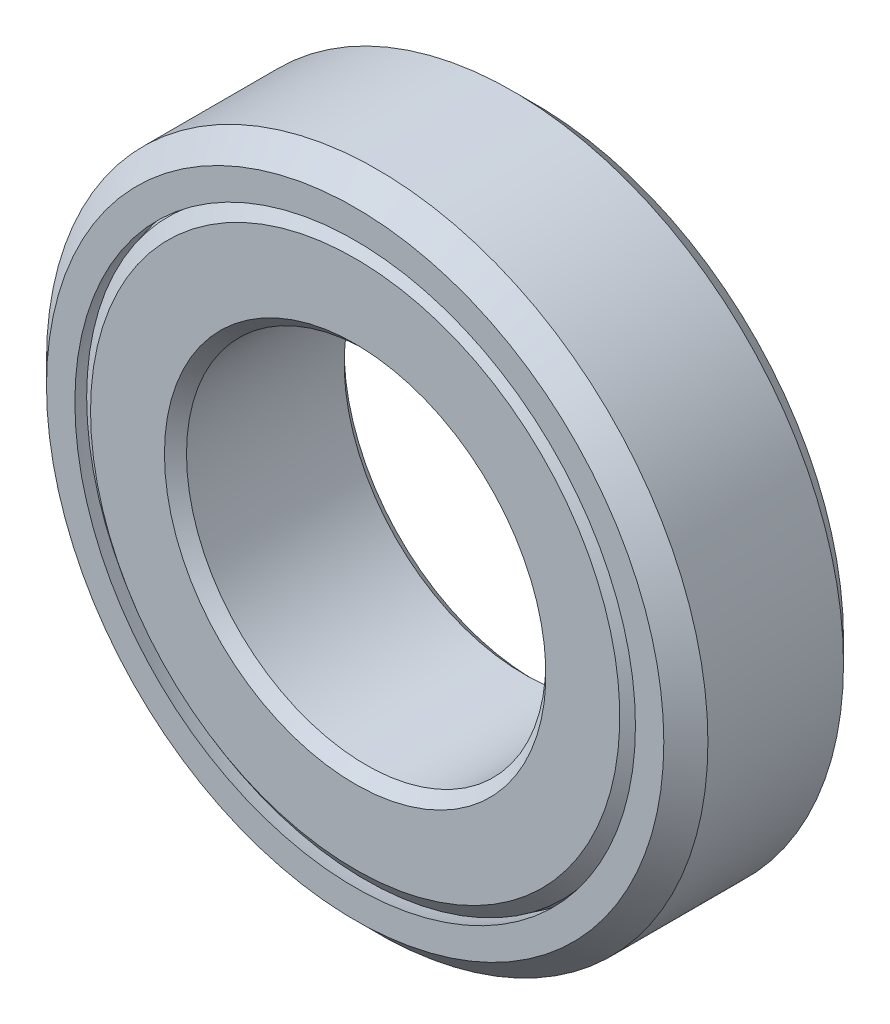
ISO-10303-21;
HEADER;
FILE_DESCRIPTION(('STEP AP214'),'2;1');
FILE_NAME('part.step','',(''),(''),'','','');
FILE_SCHEMA(('AUTOMOTIVE_DESIGN { 1 0 10303 214 1 1 1 1 }'));
ENDSEC;
DATA;
#1=APPLICATION_CONTEXT('core data for automotive mechanical design processes');
#2=APPLICATION_PROTOCOL_DEFINITION('international standard','automotive_design',2000,#1);
#3=PRODUCT_CONTEXT('',#1,'mechanical');
#4=PRODUCT('Part','Part','',(#3));
#5=PRODUCT_RELATED_PRODUCT_CATEGORY('part','',(#4));
#6=PRODUCT_DEFINITION_FORMATION('','',#4);
#7=PRODUCT_DEFINITION_CONTEXT('part definition',#1,'design');
#8=PRODUCT_DEFINITION('design','',#6,#7);
#9=PRODUCT_DEFINITION_SHAPE('','',#8);
#10=(LENGTH_UNIT() NAMED_UNIT(*) SI_UNIT(.MILLI.,.METRE.));
#11=(NAMED_UNIT(*) PLANE_ANGLE_UNIT() SI_UNIT($,.RADIAN.));
#12=(NAMED_UNIT(*) SI_UNIT($,.STERADIAN.) SOLID_ANGLE_UNIT());
#13=UNCERTAINTY_MEASURE_WITH_UNIT(LENGTH_MEASURE(1.E-05),#10,'distance_accuracy_value','');
#14=(GEOMETRIC_REPRESENTATION_CONTEXT(3) GLOBAL_UNCERTAINTY_ASSIGNED_CONTEXT((#13)) GLOBAL_UNIT_ASSIGNED_CONTEXT((#10,
#11,#12)) REPRESENTATION_CONTEXT('',''));
#15=CARTESIAN_POINT('',(0.,0.,0.));
#16=DIRECTION('',(0.,0.,1.));
#17=DIRECTION('',(1.,0.,0.));
#18=AXIS2_PLACEMENT_3D('',#15,#16,#17);
#19=CARTESIAN_POINT('',(0.,0.,-4.075));
#20=DIRECTION('',(0.,0.,1.));
#21=DIRECTION('',(1.,0.,0.));
#22=AXIS2_PLACEMENT_3D('',#19,#20,#21);
#23=PLANE('',#22);
#24=CARTESIAN_POINT('',(0.,0.,-4.075));
#25=DIRECTION('',(0.,0.,1.));
#26=DIRECTION('',(1.,0.,0.));
#27=AXIS2_PLACEMENT_3D('',#24,#25,#26);
#28=CIRCLE('',#27,14.);
#29=CARTESIAN_POINT('',(14.,0.,-4.075));
#30=VERTEX_POINT('',#29);
#31=EDGE_CURVE('E54',#30,#30,#28,.F.);
#32=ORIENTED_EDGE('',*,*,#31,.T.);
#33=EDGE_LOOP('',(#32));
#34=FACE_BOUND('',#33,.T.);
#35=CARTESIAN_POINT('',(0.,0.,-4.075));
#36=DIRECTION('',(0.,0.,1.));
#37=DIRECTION('',(1.,0.,0.));
#38=AXIS2_PLACEMENT_3D('',#35,#36,#37);
#39=CIRCLE('',#38,12.7128625808667);
#40=CARTESIAN_POINT('',(-12.7128625808667,0.,-4.075));
#41=VERTEX_POINT('',#40);
#42=EDGE_CURVE('E67',#41,#41,#39,.T.);
#43=ORIENTED_EDGE('',*,*,#42,.T.);
#44=EDGE_LOOP('',(#43));
#45=FACE_BOUND('',#44,.T.);
#46=ADVANCED_FACE('F46',(#34,#45),#23,.F.);
#47=CARTESIAN_POINT('',(0.,0.,4.075));
#48=DIRECTION('',(0.,0.,-1.));
#49=DIRECTION('',(-1.,0.,0.));
#50=AXIS2_PLACEMENT_3D('',#47,#48,#49);
#51=PLANE('',#50);
#52=CARTESIAN_POINT('',(0.,0.,4.075));
#53=DIRECTION('',(0.,0.,-1.));
#54=DIRECTION('',(-1.,0.,0.));
#55=AXIS2_PLACEMENT_3D('',#52,#53,#54);
#56=CIRCLE('',#55,14.);
#57=CARTESIAN_POINT('',(-14.,0.,4.075));
#58=VERTEX_POINT('',#57);
#59=EDGE_CURVE('E11',#58,#58,#56,.F.);
#60=ORIENTED_EDGE('',*,*,#59,.T.);
#61=EDGE_LOOP('',(#60));
#62=FACE_BOUND('',#61,.T.);
#63=CARTESIAN_POINT('',(0.,0.,4.075));
#64=DIRECTION('',(0.,0.,1.));
#65=DIRECTION('',(1.,0.,0.));
#66=AXIS2_PLACEMENT_3D('',#63,#64,#65);
#67=CIRCLE('',#66,12.7128625808667);
#68=CARTESIAN_POINT('',(-12.7128625808667,0.,4.075));
#69=VERTEX_POINT('',#68);
#70=EDGE_CURVE('E70',#69,#69,#67,.T.);
#71=ORIENTED_EDGE('',*,*,#70,.F.);
#72=EDGE_LOOP('',(#71));
#73=FACE_BOUND('',#72,.T.);
#74=ADVANCED_FACE('F77',(#62,#73),#51,.F.);
#75=CARTESIAN_POINT('',(0.,0.,0.));
#76=DIRECTION('',(0.,0.,1.));
#77=DIRECTION('',(-1.,0.,0.));
#78=AXIS2_PLACEMENT_3D('',#75,#76,#77);
#79=SPHERICAL_SURFACE('',#78,13.35);
#80=CARTESIAN_POINT('',(-12.7128625808667,0.,4.075));
#81=CARTESIAN_POINT('',(-12.7391968726643,0.,3.99284472978797));
#82=CARTESIAN_POINT('',(-12.764734574483,0.,3.91043412341195));
#83=CARTESIAN_POINT('',(-12.8142076748018,0.,3.74513335442746));
#84=CARTESIAN_POINT('',(-12.8381430733019,0.,3.66224319181899));
#85=CARTESIAN_POINT('',(-12.8844024436231,0.,3.49601442646513));
#86=CARTESIAN_POINT('',(-12.9067264154441,0.,3.41267582371974));
#87=CARTESIAN_POINT('',(-12.949754576065,0.,3.24558151102869));
#88=CARTESIAN_POINT('',(-12.9704587648649,0.,3.16182580108304));
#89=CARTESIAN_POINT('',(-13.0102395686577,0.,2.99392875075675));
#90=CARTESIAN_POINT('',(-13.0293161836506,0.,2.90978741037612));
#91=CARTESIAN_POINT('',(-13.065834672351,0.,2.74115072435144));
#92=CARTESIAN_POINT('',(-13.0832765460585,0.,2.65665537870738));
#93=CARTESIAN_POINT('',(-13.1165189960213,0.,2.48734243945082));
#94=CARTESIAN_POINT('',(-13.1323195722765,0.,2.40252484583832));
#95=CARTESIAN_POINT('',(-13.1622734888798,0.,2.23259928930536));
#96=CARTESIAN_POINT('',(-13.1764268292277,0.,2.14749132638491));
#97=CARTESIAN_POINT('',(-13.2030809544505,0.,1.97701701896486));
#98=CARTESIAN_POINT('',(-13.2155817393252,0.,1.89165067446527));
#99=CARTESIAN_POINT('',(-13.2389260552066,0.,1.7206916887461));
#100=CARTESIAN_POINT('',(-13.2497695862133,0.,1.63509904752652));
#101=CARTESIAN_POINT('',(-13.2697953188248,0.,1.46371963827511));
#102=CARTESIAN_POINT('',(-13.2789775204296,0.,1.37793287024329));
#103=CARTESIAN_POINT('',(-13.2956771431171,0.,1.20619745023881));
#104=CARTESIAN_POINT('',(-13.3031945641997,0.,1.12024879826615));
#105=CARTESIAN_POINT('',(-13.3165618004274,0.,0.948221914094963));
#106=CARTESIAN_POINT('',(-13.3224116155723,0.,0.862143681896441));
#107=CARTESIAN_POINT('',(-13.3324414412775,0.,0.689889989691202));
#108=CARTESIAN_POINT('',(-13.3366214518377,0.,0.603714529684486));
#109=CARTESIAN_POINT('',(-13.3433100973206,0.,0.431298770823476));
#110=CARTESIAN_POINT('',(-13.3458187322432,0.,0.345058471969183));
#111=CARTESIAN_POINT('',(-13.3491636835829,0.,0.17254544874326));
#112=CARTESIAN_POINT('',(-13.35,0.,0.08627272437163));
#113=CARTESIAN_POINT('',(-13.35,0.,-0.08627272437163));
#114=CARTESIAN_POINT('',(-13.3491636835829,0.,-0.17254544874326));
#115=CARTESIAN_POINT('',(-13.3458187322432,0.,-0.345058471969183));
#116=CARTESIAN_POINT('',(-13.3433100973206,0.,-0.431298770823476));
#117=CARTESIAN_POINT('',(-13.3366214518377,0.,-0.603714529684486));
#118=CARTESIAN_POINT('',(-13.3324414412775,0.,-0.689889989691202));
#119=CARTESIAN_POINT('',(-13.3224116155723,0.,-0.862143681896441));
#120=CARTESIAN_POINT('',(-13.3165618004274,0.,-0.948221914094963));
#121=CARTESIAN_POINT('',(-13.3031945641997,0.,-1.12024879826615));
#122=CARTESIAN_POINT('',(-13.2956771431171,0.,-1.20619745023881));
#123=CARTESIAN_POINT('',(-13.2789775204296,0.,-1.37793287024329));
#124=CARTESIAN_POINT('',(-13.2697953188248,0.,-1.46371963827511));
#125=CARTESIAN_POINT('',(-13.2497695862133,0.,-1.63509904752652));
#126=CARTESIAN_POINT('',(-13.2389260552066,0.,-1.7206916887461));
#127=CARTESIAN_POINT('',(-13.2155817393252,0.,-1.89165067446527));
#128=CARTESIAN_POINT('',(-13.2030809544505,0.,-1.97701701896486));
#129=CARTESIAN_POINT('',(-13.1764268292277,0.,-2.14749132638491));
#130=CARTESIAN_POINT('',(-13.1622734888798,0.,-2.23259928930536));
#131=CARTESIAN_POINT('',(-13.1323195722765,0.,-2.40252484583832));
#132=CARTESIAN_POINT('',(-13.1165189960213,0.,-2.48734243945082));
#133=CARTESIAN_POINT('',(-13.0832765460585,0.,-2.65665537870738));
#134=CARTESIAN_POINT('',(-13.065834672351,0.,-2.74115072435144));
#135=CARTESIAN_POINT('',(-13.0293161836506,0.,-2.90978741037612));
#136=CARTESIAN_POINT('',(-13.0102395686577,0.,-2.99392875075675));
#137=CARTESIAN_POINT('',(-12.9704587648649,0.,-3.16182580108304));
#138=CARTESIAN_POINT('',(-12.949754576065,0.,-3.24558151102869));
#139=CARTESIAN_POINT('',(-12.9067264154441,0.,-3.41267582371974));
#140=CARTESIAN_POINT('',(-12.8844024436231,0.,-3.49601442646513));
#141=CARTESIAN_POINT('',(-12.8381430733019,0.,-3.66224319181899));
#142=CARTESIAN_POINT('',(-12.8142076748018,0.,-3.74513335442746));
#143=CARTESIAN_POINT('',(-12.764734574483,0.,-3.91043412341195));
#144=CARTESIAN_POINT('',(-12.7391968726643,0.,-3.99284472978797));
#145=CARTESIAN_POINT('',(-12.7128625808667,0.,-4.075));
#146=B_SPLINE_CURVE_WITH_KNOTS('',3,(#80,#81,#82,#83,#84,#85,#86,#87,#88,#89,#90,#91,#92,#93,
#94,#95,#96,#97,#98,#99,#100,#101,#102,#103,#104,#105,#106,#107,#108,#109,#110,#111,#112,#113,
#114,#115,#116,#117,#118,#119,#120,#121,#122,#123,#124,#125,#126,#127,#128,#129,#130,#131,#132,
#133,#134,#135,#136,#137,#138,#139,#140,#141,#142,#143,#144,#145),.UNSPECIFIED.,.F.,.F.,(4,2,2,
2,2,2,2,2,2,2,2,2,2,2,2,2,2,2,2,2,2,2,2,2,2,2,2,2,2,2,2,2,4),(0.,0.258814120020448,
0.517628240040896,0.776442360061344,1.03525648008179,1.29407060010224,1.55288472012269,
1.81169884014314,2.07051296016358,2.32932708018403,2.58814120020448,2.84695532022493,
3.10576944024538,3.36458356026582,3.62339768028627,3.88221180030672,4.14102592032717,
4.39984004034762,4.65865416036806,4.91746828038851,5.17628240040896,5.43509652042941,
5.69391064044985,5.9527247604703,6.21153888049075,6.4703530005112,6.72916712053164,
6.98798124055209,7.24679536057254,7.50560948059299,7.76442360061344,8.02323772063389,
8.28205184065433),.UNSPECIFIED.);
#147=EDGE_CURVE('BSEAM74',#69,#41,#146,.T.);
#148=ORIENTED_EDGE('',*,*,#70,.T.);
#149=ORIENTED_EDGE('',*,*,#42,.F.);
#150=ORIENTED_EDGE('',*,*,#147,.T.);
#151=ORIENTED_EDGE('',*,*,#147,.F.);
#152=EDGE_LOOP('',(#148,#150,#149,#151));
#153=FACE_BOUND('',#152,.T.);
#154=ADVANCED_FACE('F74',(#153),#79,.F.);
#155=CARTESIAN_POINT('',(0.,0.,-4.075));
#156=DIRECTION('',(0.,0.,1.));
#157=DIRECTION('',(1.,0.,0.));
#158=AXIS2_PLACEMENT_3D('',#155,#156,#157);
#159=CYLINDRICAL_SURFACE('',#158,15.);
#160=CARTESIAN_POINT('',(0.,0.,-3.07499999999999));
#161=DIRECTION('',(0.,0.,1.));
#162=DIRECTION('',(1.,0.,0.));
#163=AXIS2_PLACEMENT_3D('',#160,#161,#162);
#164=CIRCLE('',#163,15.);
#165=CARTESIAN_POINT('',(15.,0.,-3.07499999999999));
#166=VERTEX_POINT('',#165);
#167=EDGE_CURVE('E58',#166,#166,#164,.T.);
#168=ORIENTED_EDGE('',*,*,#167,.T.);
#169=EDGE_LOOP('',(#168));
#170=FACE_BOUND('',#169,.T.);
#171=CARTESIAN_POINT('',(0.,0.,3.07500000000001));
#172=DIRECTION('',(0.,0.,-1.));
#173=DIRECTION('',(-1.,0.,0.));
#174=AXIS2_PLACEMENT_3D('',#171,#172,#173);
#175=CIRCLE('',#174,15.);
#176=CARTESIAN_POINT('',(-15.,0.,3.07500000000001));
#177=VERTEX_POINT('',#176);
#178=EDGE_CURVE('E62',#177,#177,#175,.T.);
#179=ORIENTED_EDGE('',*,*,#178,.T.);
#180=EDGE_LOOP('',(#179));
#181=FACE_BOUND('',#180,.T.);
#182=ADVANCED_FACE('F84',(#170,#181),#159,.T.);
#183=CARTESIAN_POINT('',(0.,0.,-3.07499999999999));
#184=DIRECTION('',(0.,0.,1.));
#185=DIRECTION('',(1.,0.,0.));
#186=AXIS2_PLACEMENT_3D('',#183,#184,#185);
#187=CONICAL_SURFACE('',#186,15.,0.785398163397447);
#188=ORIENTED_EDGE('',*,*,#31,.F.);
#189=EDGE_LOOP('',(#188));
#190=FACE_BOUND('',#189,.T.);
#191=ORIENTED_EDGE('',*,*,#167,.F.);
#192=EDGE_LOOP('',(#191));
#193=FACE_BOUND('',#192,.T.);
#194=ADVANCED_FACE('F89',(#190,#193),#187,.T.);
#195=CARTESIAN_POINT('',(0.,0.,4.075));
#196=DIRECTION('',(0.,0.,-1.));
#197=DIRECTION('',(-1.,0.,0.));
#198=AXIS2_PLACEMENT_3D('',#195,#196,#197);
#199=CONICAL_SURFACE('',#198,14.,0.785398163397448);
#200=ORIENTED_EDGE('',*,*,#178,.F.);
#201=EDGE_LOOP('',(#200));
#202=FACE_BOUND('',#201,.T.);
#203=ORIENTED_EDGE('',*,*,#59,.F.);
#204=EDGE_LOOP('',(#203));
#205=FACE_BOUND('',#204,.T.);
#206=ADVANCED_FACE('F49',(#202,#205),#199,.T.);
#207=CLOSED_SHELL('',(#46,#74,#154,#182,#194,#206));
#208=MANIFOLD_SOLID_BREP('B2',#207);
#209=CARTESIAN_POINT('',(0.,0.,-4.075));
#210=DIRECTION('',(0.,0.,1.));
#211=DIRECTION('',(1.,0.,0.));
#212=AXIS2_PLACEMENT_3D('',#209,#210,#211);
#213=PLANE('',#212);
#214=CARTESIAN_POINT('',(0.,0.,-4.075));
#215=DIRECTION('',(0.,0.,1.));
#216=DIRECTION('',(1.,0.,0.));
#217=AXIS2_PLACEMENT_3D('',#214,#215,#216);
#218=CIRCLE('',#217,8.65000000000001);
#219=CARTESIAN_POINT('',(8.65000000000001,0.,-4.075));
#220=VERTEX_POINT('',#219);
#221=EDGE_CURVE('E170',#220,#220,#218,.T.);
#222=ORIENTED_EDGE('',*,*,#221,.T.);
#223=EDGE_LOOP('',(#222));
#224=FACE_BOUND('',#223,.T.);
#225=CARTESIAN_POINT('',(0.,0.,-4.075));
#226=DIRECTION('',(0.,0.,1.));
#227=DIRECTION('',(1.,0.,0.));
#228=AXIS2_PLACEMENT_3D('',#225,#226,#227);
#229=CIRCLE('',#228,12.0026747138362);
#230=CARTESIAN_POINT('',(12.0026747138362,0.,-4.075));
#231=VERTEX_POINT('',#230);
#232=EDGE_CURVE('E173',#231,#231,#229,.F.);
#233=ORIENTED_EDGE('',*,*,#232,.T.);
#234=EDGE_LOOP('',(#233));
#235=FACE_BOUND('',#234,.T.);
#236=ADVANCED_FACE('F143',(#224,#235),#213,.F.);
#237=CARTESIAN_POINT('',(0.,0.,0.));
#238=DIRECTION('',(0.,0.,1.));
#239=DIRECTION('',(-1.,0.,0.));
#240=AXIS2_PLACEMENT_3D('',#237,#238,#239);
#241=SPHERICAL_SURFACE('',#240,13.15);
#242=CARTESIAN_POINT('',(0.,0.,-3.60865422846849));
#243=DIRECTION('',(0.,0.,1.));
#244=DIRECTION('',(1.,0.,0.));
#245=AXIS2_PLACEMENT_3D('',#242,#243,#244);
#246=CIRCLE('',#245,12.6451617094981);
#247=CARTESIAN_POINT('',(-12.6451617094981,0.,-3.60865422846849));
#248=VERTEX_POINT('',#247);
#249=EDGE_CURVE('E45',#248,#248,#246,.T.);
#250=CARTESIAN_POINT('',(0.,0.,3.60865422846851));
#251=DIRECTION('',(0.,0.,-1.));
#252=DIRECTION('',(-1.,0.,0.));
#253=AXIS2_PLACEMENT_3D('',#250,#251,#252);
#254=CIRCLE('',#253,12.6451617094981);
#255=CARTESIAN_POINT('',(-12.6451617094981,0.,3.60865422846851));
#256=VERTEX_POINT('',#255);
#257=EDGE_CURVE('E151',#256,#256,#254,.T.);
#258=CARTESIAN_POINT('',(-12.6451617094981,0.,-3.60865422846849));
#259=CARTESIAN_POINT('',(-12.6660610715677,0.,-3.53542059252351));
#260=CARTESIAN_POINT('',(-12.6863241054867,0.,-3.46200536460335));
#261=CARTESIAN_POINT('',(-12.7255717048065,0.,-3.31483396703231));
#262=CARTESIAN_POINT('',(-12.7445562702073,0.,-3.24107779738144));
#263=CARTESIAN_POINT('',(-12.7812411202737,0.,-3.0932467585686));
#264=CARTESIAN_POINT('',(-12.7989414049392,0.,-3.01917188940663));
#265=CARTESIAN_POINT('',(-12.833052372396,0.,-2.87072581756992));
#266=CARTESIAN_POINT('',(-12.8494630551872,0.,-2.79635461489517));
#267=CARTESIAN_POINT('',(-12.8809898593266,0.,-2.64733832409312));
#268=CARTESIAN_POINT('',(-12.8961059806747,0.,-2.5726932359658));
#269=CARTESIAN_POINT('',(-12.9250391005587,0.,-2.42315170697352));
#270=CARTESIAN_POINT('',(-12.9388560990946,0.,-2.34825526610855));
#271=CARTESIAN_POINT('',(-12.9651868021472,0.,-2.19823363969845));
#272=CARTESIAN_POINT('',(-12.977700506664,0.,-2.12310845415332));
#273=CARTESIAN_POINT('',(-13.0014208444162,0.,-1.97265201563122));
#274=CARTESIAN_POINT('',(-13.0126274776515,0.,-1.89732076265424));
#275=CARTESIAN_POINT('',(-13.0337302899866,0.,-1.74647492868198));
#276=CARTESIAN_POINT('',(-13.0436264690864,0.,-1.67096034768669));
#277=CARTESIAN_POINT('',(-13.0621053859072,0.,-1.51977065244077));
#278=CARTESIAN_POINT('',(-13.0706881236282,0.,-1.44409553819014));
#279=CARTESIAN_POINT('',(-13.086537566912,0.,-1.29260761965219));
#280=CARTESIAN_POINT('',(-13.0938042724749,0.,-1.21679481536487));
#281=CARTESIAN_POINT('',(-13.107019457922,0.,-1.06505440153592));
#282=CARTESIAN_POINT('',(-13.1129679378064,0.,-0.989126791994288));
#283=CARTESIAN_POINT('',(-13.1235448762938,0.,-0.837179687093888));
#284=CARTESIAN_POINT('',(-13.1281733348969,0.,-0.761160191735122));
#285=CARTESIAN_POINT('',(-13.1361088336796,0.,-0.609052262374257));
#286=CARTESIAN_POINT('',(-13.1394158738593,0.,-0.53296382837216));
#287=CARTESIAN_POINT('',(-13.1447075375352,0.,-0.380740989708175));
#288=CARTESIAN_POINT('',(-13.1466921610314,0.,-0.304606585046288));
#289=CARTESIAN_POINT('',(-13.1493383922638,0.,-0.152314786922931));
#290=CARTESIAN_POINT('',(-13.15,0.,-0.0761573934614611));
#291=CARTESIAN_POINT('',(-13.15,0.,0.0761573934614787));
#292=CARTESIAN_POINT('',(-13.1493383922638,0.,0.152314786922949));
#293=CARTESIAN_POINT('',(-13.1466921610314,0.,0.304606585046305));
#294=CARTESIAN_POINT('',(-13.1447075375352,0.,0.380740989708192));
#295=CARTESIAN_POINT('',(-13.1394158738593,0.,0.532963828372177));
#296=CARTESIAN_POINT('',(-13.1361088336796,0.,0.609052262374275));
#297=CARTESIAN_POINT('',(-13.1281733348969,0.,0.761160191735139));
#298=CARTESIAN_POINT('',(-13.1235448762938,0.,0.837179687093906));
#299=CARTESIAN_POINT('',(-13.1129679378064,0.,0.989126791994305));
#300=CARTESIAN_POINT('',(-13.107019457922,0.,1.06505440153594));
#301=CARTESIAN_POINT('',(-13.0938042724749,0.,1.21679481536489));
#302=CARTESIAN_POINT('',(-13.086537566912,0.,1.29260761965221));
#303=CARTESIAN_POINT('',(-13.0706881236282,0.,1.44409553819015));
#304=CARTESIAN_POINT('',(-13.0621053859072,0.,1.51977065244078));
#305=CARTESIAN_POINT('',(-13.0436264690864,0.,1.6709603476867));
#306=CARTESIAN_POINT('',(-13.0337302899866,0.,1.74647492868199));
#307=CARTESIAN_POINT('',(-13.0126274776515,0.,1.89732076265426));
#308=CARTESIAN_POINT('',(-13.0014208444162,0.,1.97265201563124));
#309=CARTESIAN_POINT('',(-12.977700506664,0.,2.12310845415334));
#310=CARTESIAN_POINT('',(-12.9651868021472,0.,2.19823363969847));
#311=CARTESIAN_POINT('',(-12.9388560990946,0.,2.34825526610857));
#312=CARTESIAN_POINT('',(-12.9250391005587,0.,2.42315170697354));
#313=CARTESIAN_POINT('',(-12.8961059806747,0.,2.57269323596582));
#314=CARTESIAN_POINT('',(-12.8809898593266,0.,2.64733832409313));
#315=CARTESIAN_POINT('',(-12.8494630551872,0.,2.79635461489519));
#316=CARTESIAN_POINT('',(-12.833052372396,0.,2.87072581756993));
#317=CARTESIAN_POINT('',(-12.7989414049392,0.,3.01917188940665));
#318=CARTESIAN_POINT('',(-12.7812411202737,0.,3.09324675856861));
#319=CARTESIAN_POINT('',(-12.7445562702073,0.,3.24107779738145));
#320=CARTESIAN_POINT('',(-12.7255717048065,0.,3.31483396703233));
#321=CARTESIAN_POINT('',(-12.6863241054867,0.,3.46200536460336));
#322=CARTESIAN_POINT('',(-12.6660610715677,0.,3.53542059252352));
#323=CARTESIAN_POINT('',(-12.6451617094981,0.,3.60865422846851));
#324=B_SPLINE_CURVE_WITH_KNOTS('',3,(#258,#259,#260,#261,#262,#263,#264,#265,#266,#267,#268,
#269,#270,#271,#272,#273,#274,#275,#276,#277,#278,#279,#280,#281,#282,#283,#284,#285,#286,#287,
#288,#289,#290,#291,#292,#293,#294,#295,#296,#297,#298,#299,#300,#301,#302,#303,#304,#305,#306,
#307,#308,#309,#310,#311,#312,#313,#314,#315,#316,#317,#318,#319,#320,#321,#322,#323),
.UNSPECIFIED.,.F.,.F.,(4,2,2,2,2,2,2,2,2,2,2,2,2,2,2,2,2,2,2,2,2,2,2,2,2,2,2,2,2,2,2,2,4),(0.,
0.228469306838682,0.456938613677364,0.685407920516046,0.913877227354727,1.14234653419341,
1.37081584103209,1.59928514787077,1.82775445470946,2.05622376154814,2.28469306838682,
2.5131623752255,2.74163168206418,2.97010098890286,3.19857029574155,3.42703960258023,
3.65550890941891,3.88397821625759,4.11244752309627,4.34091682993496,4.56938613677364,
4.79785544361232,5.026324750451,5.25479405728968,5.48326336412836,5.71173267096705,
5.94020197780573,6.16867128464441,6.39714059148309,6.62560989832178,6.85407920516046,
7.08254851199914,7.31101781883782),.UNSPECIFIED.);
#325=EDGE_CURVE('BSEAM192',#248,#256,#324,.T.);
#326=ORIENTED_EDGE('',*,*,#249,.T.);
#327=ORIENTED_EDGE('',*,*,#257,.T.);
#328=ORIENTED_EDGE('',*,*,#325,.T.);
#329=ORIENTED_EDGE('',*,*,#325,.F.);
#330=EDGE_LOOP('',(#326,#328,#327,#329));
#331=FACE_BOUND('',#330,.T.);
#332=ADVANCED_FACE('F192',(#331),#241,.T.);
#333=CARTESIAN_POINT('',(0.,0.,4.075));
#334=DIRECTION('',(0.,0.,-1.));
#335=DIRECTION('',(-1.,0.,0.));
#336=AXIS2_PLACEMENT_3D('',#333,#334,#335);
#337=PLANE('',#336);
#338=CARTESIAN_POINT('',(0.,0.,4.075));
#339=DIRECTION('',(0.,0.,-1.));
#340=DIRECTION('',(-1.,0.,0.));
#341=AXIS2_PLACEMENT_3D('',#338,#339,#340);
#342=CIRCLE('',#341,8.65);
#343=CARTESIAN_POINT('',(-8.65,0.,4.075));
#344=VERTEX_POINT('',#343);
#345=EDGE_CURVE('E155',#344,#344,#342,.T.);
#346=ORIENTED_EDGE('',*,*,#345,.T.);
#347=EDGE_LOOP('',(#346));
#348=FACE_BOUND('',#347,.T.);
#349=CARTESIAN_POINT('',(0.,0.,4.075));
#350=DIRECTION('',(0.,0.,-1.));
#351=DIRECTION('',(-1.,0.,0.));
#352=AXIS2_PLACEMENT_3D('',#349,#350,#351);
#353=CIRCLE('',#352,12.0026747138362);
#354=CARTESIAN_POINT('',(-12.0026747138362,0.,4.075));
#355=VERTEX_POINT('',#354);
#356=EDGE_CURVE('E159',#355,#355,#353,.F.);
#357=ORIENTED_EDGE('',*,*,#356,.T.);
#358=EDGE_LOOP('',(#357));
#359=FACE_BOUND('',#358,.T.);
#360=ADVANCED_FACE('F198',(#348,#359),#337,.F.);
#361=CARTESIAN_POINT('',(0.,0.,13.15));
#362=DIRECTION('',(0.,0.,1.));
#363=DIRECTION('',(1.,0.,0.));
#364=AXIS2_PLACEMENT_3D('',#361,#362,#363);
#365=CYLINDRICAL_SURFACE('',#364,8.15);
#366=CARTESIAN_POINT('',(0.,0.,-3.57499999999999));
#367=DIRECTION('',(0.,0.,1.));
#368=DIRECTION('',(1.,0.,0.));
#369=AXIS2_PLACEMENT_3D('',#366,#367,#368);
#370=CIRCLE('',#369,8.15);
#371=CARTESIAN_POINT('',(8.15,0.,-3.57499999999999));
#372=VERTEX_POINT('',#371);
#373=EDGE_CURVE('E164',#372,#372,#370,.F.);
#374=ORIENTED_EDGE('',*,*,#373,.T.);
#375=EDGE_LOOP('',(#374));
#376=FACE_BOUND('',#375,.T.);
#377=CARTESIAN_POINT('',(0.,0.,3.575));
#378=DIRECTION('',(0.,0.,-1.));
#379=DIRECTION('',(-1.,0.,0.));
#380=AXIS2_PLACEMENT_3D('',#377,#378,#379);
#381=CIRCLE('',#380,8.15);
#382=CARTESIAN_POINT('',(-8.15,0.,3.575));
#383=VERTEX_POINT('',#382);
#384=EDGE_CURVE('E167',#383,#383,#381,.F.);
#385=ORIENTED_EDGE('',*,*,#384,.T.);
#386=EDGE_LOOP('',(#385));
#387=FACE_BOUND('',#386,.T.);
#388=ADVANCED_FACE('F207',(#376,#387),#365,.F.);
#389=CARTESIAN_POINT('',(0.,0.,-4.075));
#390=DIRECTION('',(0.,0.,-1.));
#391=DIRECTION('',(-1.,0.,0.));
#392=AXIS2_PLACEMENT_3D('',#389,#390,#391);
#393=CONICAL_SURFACE('',#392,8.65000000000001,0.785398163397452);
#394=ORIENTED_EDGE('',*,*,#373,.F.);
#395=EDGE_LOOP('',(#394));
#396=FACE_BOUND('',#395,.T.);
#397=ORIENTED_EDGE('',*,*,#221,.F.);
#398=EDGE_LOOP('',(#397));
#399=FACE_BOUND('',#398,.T.);
#400=ADVANCED_FACE('F187',(#396,#399),#393,.F.);
#401=CARTESIAN_POINT('',(0.,0.,3.575));
#402=DIRECTION('',(0.,0.,1.));
#403=DIRECTION('',(1.,0.,0.));
#404=AXIS2_PLACEMENT_3D('',#401,#402,#403);
#405=CONICAL_SURFACE('',#404,8.15,0.785398163397445);
#406=ORIENTED_EDGE('',*,*,#345,.F.);
#407=EDGE_LOOP('',(#406));
#408=FACE_BOUND('',#407,.T.);
#409=ORIENTED_EDGE('',*,*,#384,.F.);
#410=EDGE_LOOP('',(#409));
#411=FACE_BOUND('',#410,.T.);
#412=ADVANCED_FACE('F181',(#408,#411),#405,.F.);
#413=CARTESIAN_POINT('',(0.,0.,-3.60865422846849));
#414=DIRECTION('',(0.,0.,1.));
#415=DIRECTION('',(1.,0.,0.));
#416=AXIS2_PLACEMENT_3D('',#413,#414,#415);
#417=CONICAL_SURFACE('',#416,12.6451617094981,0.942934691280652);
#418=ORIENTED_EDGE('',*,*,#232,.F.);
#419=EDGE_LOOP('',(#418));
#420=FACE_BOUND('',#419,.T.);
#421=ORIENTED_EDGE('',*,*,#249,.F.);
#422=EDGE_LOOP('',(#421));
#423=FACE_BOUND('',#422,.T.);
#424=ADVANCED_FACE('F178',(#420,#423),#417,.T.);
#425=CARTESIAN_POINT('',(0.,0.,4.075));
#426=DIRECTION('',(0.,0.,-1.));
#427=DIRECTION('',(-1.,0.,0.));
#428=AXIS2_PLACEMENT_3D('',#425,#426,#427);
#429=CONICAL_SURFACE('',#428,12.0026747138362,0.942934691280652);
#430=CARTESIAN_POINT('',(-12.6451617094981,0.,3.60865422846851));
#431=CARTESIAN_POINT('',(-12.6384691366266,0.,3.61351199692196));
#432=CARTESIAN_POINT('',(-12.6317765637551,0.,3.61836976537542));
#433=CARTESIAN_POINT('',(-12.6183914180122,0.,3.62808530228232));
#434=CARTESIAN_POINT('',(-12.6116988451407,0.,3.63294307073578));
#435=CARTESIAN_POINT('',(-12.5983136993977,0.,3.64265860764268));
#436=CARTESIAN_POINT('',(-12.5916211265263,0.,3.64751637609613));
#437=CARTESIAN_POINT('',(-12.5782359807833,0.,3.65723191300304));
#438=CARTESIAN_POINT('',(-12.5715434079118,0.,3.66208968145649));
#439=CARTESIAN_POINT('',(-12.5581582621689,0.,3.6718052183634));
#440=CARTESIAN_POINT('',(-12.5514656892974,0.,3.67666298681685));
#441=CARTESIAN_POINT('',(-12.5380805435544,0.,3.68637852372376));
#442=CARTESIAN_POINT('',(-12.531387970683,0.,3.69123629217721));
#443=CARTESIAN_POINT('',(-12.51800282494,0.,3.70095182908412));
#444=CARTESIAN_POINT('',(-12.5113102520685,0.,3.70580959753757));
#445=CARTESIAN_POINT('',(-12.4979251063256,0.,3.71552513444448));
#446=CARTESIAN_POINT('',(-12.4912325334541,0.,3.72038290289793));
#447=CARTESIAN_POINT('',(-12.4778473877111,0.,3.73009843980484));
#448=CARTESIAN_POINT('',(-12.4711548148397,0.,3.73495620825829));
#449=CARTESIAN_POINT('',(-12.4577696690967,0.,3.7446717451652));
#450=CARTESIAN_POINT('',(-12.4510770962252,0.,3.74952951361865));
#451=CARTESIAN_POINT('',(-12.4376919504823,0.,3.75924505052555));
#452=CARTESIAN_POINT('',(-12.4309993776108,0.,3.76410281897901));
#453=CARTESIAN_POINT('',(-12.4176142318678,0.,3.77381835588591));
#454=CARTESIAN_POINT('',(-12.4109216589964,0.,3.77867612433937));
#455=CARTESIAN_POINT('',(-12.3975365132534,0.,3.78839166124627));
#456=CARTESIAN_POINT('',(-12.3908439403819,0.,3.79324942969973));
#457=CARTESIAN_POINT('',(-12.377458794639,0.,3.80296496660663));
#458=CARTESIAN_POINT('',(-12.3707662217675,0.,3.80782273506008));
#459=CARTESIAN_POINT('',(-12.3573810760245,0.,3.81753827196699));
#460=CARTESIAN_POINT('',(-12.3506885031531,0.,3.82239604042044));
#461=CARTESIAN_POINT('',(-12.3373033574101,0.,3.83211157732735));
#462=CARTESIAN_POINT('',(-12.3306107845386,0.,3.8369693457808));
#463=CARTESIAN_POINT('',(-12.3172256387957,0.,3.84668488268771));
#464=CARTESIAN_POINT('',(-12.3105330659242,0.,3.85154265114116));
#465=CARTESIAN_POINT('',(-12.2971479201813,0.,3.86125818804807));
#466=CARTESIAN_POINT('',(-12.2904553473098,0.,3.86611595650152));
#467=CARTESIAN_POINT('',(-12.2770702015668,0.,3.87583149340843));
#468=CARTESIAN_POINT('',(-12.2703776286953,0.,3.88068926186188));
#469=CARTESIAN_POINT('',(-12.2569924829524,0.,3.89040479876879));
#470=CARTESIAN_POINT('',(-12.2502999100809,0.,3.89526256722224));
#471=CARTESIAN_POINT('',(-12.236914764338,0.,3.90497810412915));
#472=CARTESIAN_POINT('',(-12.2302221914665,0.,3.9098358725826));
#473=CARTESIAN_POINT('',(-12.2168370457235,0.,3.91955140948951));
#474=CARTESIAN_POINT('',(-12.210144472852,0.,3.92440917794296));
#475=CARTESIAN_POINT('',(-12.1967593271091,0.,3.93412471484986));
#476=CARTESIAN_POINT('',(-12.1900667542376,0.,3.93898248330332));
#477=CARTESIAN_POINT('',(-12.1766816084947,0.,3.94869802021022));
#478=CARTESIAN_POINT('',(-12.1699890356232,0.,3.95355578866368));
#479=CARTESIAN_POINT('',(-12.1566038898802,0.,3.96327132557058));
#480=CARTESIAN_POINT('',(-12.1499113170087,0.,3.96812909402404));
#481=CARTESIAN_POINT('',(-12.1365261712658,0.,3.97784463093094));
#482=CARTESIAN_POINT('',(-12.1298335983943,0.,3.98270239938439));
#483=CARTESIAN_POINT('',(-12.1164484526514,0.,3.9924179362913));
#484=CARTESIAN_POINT('',(-12.1097558797799,0.,3.99727570474475));
#485=CARTESIAN_POINT('',(-12.0963707340369,0.,4.00699124165166));
#486=CARTESIAN_POINT('',(-12.0896781611654,0.,4.01184901010511));
#487=CARTESIAN_POINT('',(-12.0762930154225,0.,4.02156454701202));
#488=CARTESIAN_POINT('',(-12.069600442551,0.,4.02642231546547));
#489=CARTESIAN_POINT('',(-12.0562152968081,0.,4.03613785237238));
#490=CARTESIAN_POINT('',(-12.0495227239366,0.,4.04099562082583));
#491=CARTESIAN_POINT('',(-12.0361375781936,0.,4.05071115773274));
#492=CARTESIAN_POINT('',(-12.0294450053221,0.,4.05556892618619));
#493=CARTESIAN_POINT('',(-12.0160598595792,0.,4.0652844630931));
#494=CARTESIAN_POINT('',(-12.0093672867077,0.,4.07014223154655));
#495=CARTESIAN_POINT('',(-12.0026747138362,0.,4.075));
#496=B_SPLINE_CURVE_WITH_KNOTS('',3,(#430,#431,#432,#433,#434,#435,#436,#437,#438,#439,#440,
#441,#442,#443,#444,#445,#446,#447,#448,#449,#450,#451,#452,#453,#454,#455,#456,#457,#458,#459,
#460,#461,#462,#463,#464,#465,#466,#467,#468,#469,#470,#471,#472,#473,#474,#475,#476,#477,#478,
#479,#480,#481,#482,#483,#484,#485,#486,#487,#488,#489,#490,#491,#492,#493,#494,#495),
.UNSPECIFIED.,.F.,.F.,(4,2,2,2,2,2,2,2,2,2,2,2,2,2,2,2,2,2,2,2,2,2,2,2,2,2,2,2,2,2,2,2,4),(0.,
0.0248091921248273,0.0496183842496543,0.074427576374483,0.0992367684993101,0.124045960624137,
0.148855152748964,0.173664344873793,0.19847353699862,0.223282729123447,0.248091921248274,
0.272901113373103,0.29771030549793,0.322519497622758,0.347328689747585,0.372137881872412,
0.39694707399724,0.421756266122068,0.446565458246895,0.471374650371722,0.49618384249655,
0.520993034621378,0.545802226746205,0.570611418871032,0.595420610995861,0.620229803120688,
0.645038995245515,0.669848187370342,0.694657379495169,0.719466571619998,0.744275763744825,
0.769084955869652,0.793894147994479),.UNSPECIFIED.);
#497=EDGE_CURVE('BSEAM146',#256,#355,#496,.T.);
#498=ORIENTED_EDGE('',*,*,#257,.F.);
#499=ORIENTED_EDGE('',*,*,#356,.F.);
#500=ORIENTED_EDGE('',*,*,#497,.T.);
#501=ORIENTED_EDGE('',*,*,#497,.F.);
#502=EDGE_LOOP('',(#498,#500,#499,#501));
#503=FACE_BOUND('',#502,.T.);
#504=ADVANCED_FACE('F146',(#503),#429,.T.);
#505=CLOSED_SHELL('',(#236,#332,#360,#388,#400,#412,#424,#504));
#506=MANIFOLD_SOLID_BREP('B6',#505);
#507=ADVANCED_BREP_SHAPE_REPRESENTATION('',(#18,#208,#506),#14);
#508=SHAPE_DEFINITION_REPRESENTATION(#9,#507);
ENDSEC;
END-ISO-10303-21;
